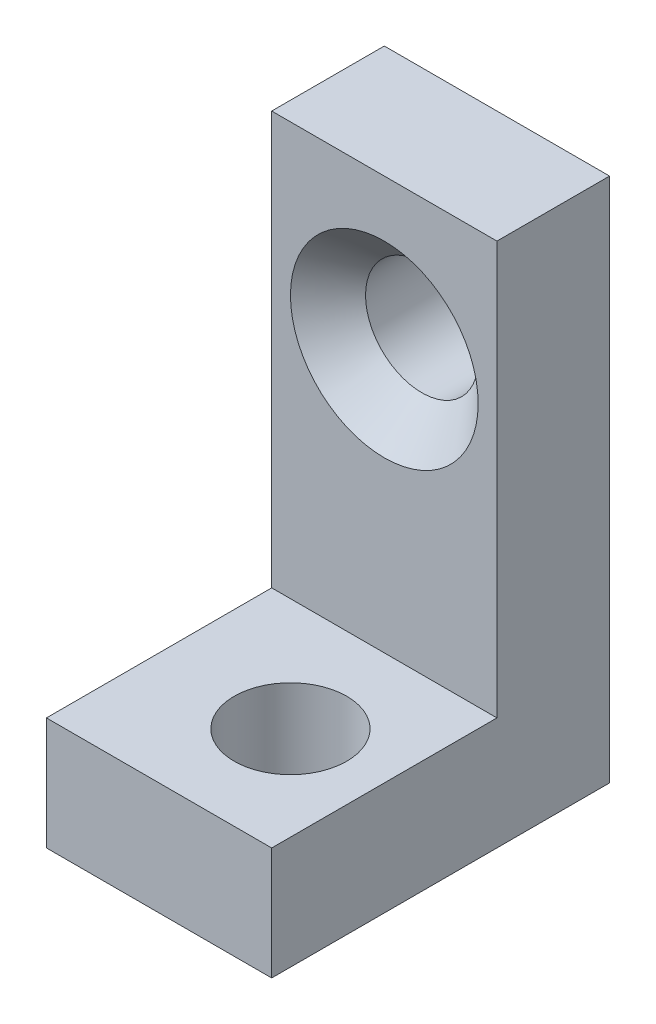
ISO-10303-21;
HEADER;
FILE_DESCRIPTION(('STEP AP214'),'2;1');
FILE_NAME('part.step','',(''),(''),'','','');
FILE_SCHEMA(('AUTOMOTIVE_DESIGN { 1 0 10303 214 1 1 1 1 }'));
ENDSEC;
DATA;
#1=APPLICATION_CONTEXT('core data for automotive mechanical design processes');
#2=APPLICATION_PROTOCOL_DEFINITION('international standard','automotive_design',2000,#1);
#3=PRODUCT_CONTEXT('',#1,'mechanical');
#4=PRODUCT('Part','Part','',(#3));
#5=PRODUCT_RELATED_PRODUCT_CATEGORY('part','',(#4));
#6=PRODUCT_DEFINITION_FORMATION('','',#4);
#7=PRODUCT_DEFINITION_CONTEXT('part definition',#1,'design');
#8=PRODUCT_DEFINITION('design','',#6,#7);
#9=PRODUCT_DEFINITION_SHAPE('','',#8);
#10=(LENGTH_UNIT() NAMED_UNIT(*) SI_UNIT(.MILLI.,.METRE.));
#11=(NAMED_UNIT(*) PLANE_ANGLE_UNIT() SI_UNIT($,.RADIAN.));
#12=(NAMED_UNIT(*) SI_UNIT($,.STERADIAN.) SOLID_ANGLE_UNIT());
#13=UNCERTAINTY_MEASURE_WITH_UNIT(LENGTH_MEASURE(1.E-05),#10,'distance_accuracy_value','');
#14=(GEOMETRIC_REPRESENTATION_CONTEXT(3) GLOBAL_UNCERTAINTY_ASSIGNED_CONTEXT((#13)) GLOBAL_UNIT_ASSIGNED_CONTEXT((#10,
#11,#12)) REPRESENTATION_CONTEXT('',''));
#15=CARTESIAN_POINT('',(0.,0.,0.));
#16=DIRECTION('',(0.,0.,1.));
#17=DIRECTION('',(1.,0.,0.));
#18=AXIS2_PLACEMENT_3D('',#15,#16,#17);
#19=CARTESIAN_POINT('',(0.,0.,3.));
#20=DIRECTION('',(0.,0.,-1.));
#21=DIRECTION('',(-1.,0.,0.));
#22=AXIS2_PLACEMENT_3D('',#19,#20,#21);
#23=PLANE('',#22);
#24=CARTESIAN_POINT('',(-1.02739726027398,2.98630136986301,3.));
#25=DIRECTION('',(0.,0.,-1.));
#26=DIRECTION('',(-1.,0.,0.));
#27=AXIS2_PLACEMENT_3D('',#24,#25,#26);
#28=CIRCLE('',#27,2.5);
#29=CARTESIAN_POINT('',(-3.52739726027398,2.98630136986301,3.));
#30=VERTEX_POINT('',#29);
#31=EDGE_CURVE('E11',#30,#30,#28,.T.);
#32=ORIENTED_EDGE('',*,*,#31,.T.);
#33=EDGE_LOOP('',(#32));
#34=FACE_BOUND('',#33,.T.);
#35=DIRECTION('',(-1.,0.,0.));
#36=VECTOR('',#35,1.);
#37=CARTESIAN_POINT('',(-4.02739726027398,-4.01369863013699,3.));
#38=LINE('',#37,#36);
#39=CARTESIAN_POINT('',(1.97260273972602,-4.01369863013699,3.));
#40=VERTEX_POINT('',#39);
#41=CARTESIAN_POINT('',(-4.02739726027398,-4.01369863013699,3.));
#42=VERTEX_POINT('',#41);
#43=EDGE_CURVE('E48',#40,#42,#38,.T.);
#44=ORIENTED_EDGE('',*,*,#43,.F.);
#45=DIRECTION('',(0.,1.,0.));
#46=VECTOR('',#45,1.);
#47=CARTESIAN_POINT('',(1.97260273972602,-7.01369863013699,3.));
#48=LINE('',#47,#46);
#49=CARTESIAN_POINT('',(1.97260273972602,6.98630136986301,3.));
#50=VERTEX_POINT('',#49);
#51=EDGE_CURVE('E86',#40,#50,#48,.T.);
#52=ORIENTED_EDGE('',*,*,#51,.T.);
#53=DIRECTION('',(-1.,0.,0.));
#54=VECTOR('',#53,1.);
#55=CARTESIAN_POINT('',(-4.02739726027398,6.98630136986301,3.));
#56=LINE('',#55,#54);
#57=CARTESIAN_POINT('',(-4.02739726027398,6.98630136986301,3.));
#58=VERTEX_POINT('',#57);
#59=EDGE_CURVE('E54',#50,#58,#56,.T.);
#60=ORIENTED_EDGE('',*,*,#59,.T.);
#61=DIRECTION('',(0.,-1.,0.));
#62=VECTOR('',#61,1.);
#63=CARTESIAN_POINT('',(-4.02739726027398,-7.01369863013699,3.));
#64=LINE('',#63,#62);
#65=EDGE_CURVE('E98',#58,#42,#64,.T.);
#66=ORIENTED_EDGE('',*,*,#65,.T.);
#67=EDGE_LOOP('',(#44,#52,#60,#66));
#68=FACE_BOUND('',#67,.T.);
#69=ADVANCED_FACE('F33',(#34,#68),#23,.F.);
#70=CARTESIAN_POINT('',(0.,0.,0.));
#71=DIRECTION('',(0.,0.,-1.));
#72=DIRECTION('',(-1.,0.,0.));
#73=AXIS2_PLACEMENT_3D('',#70,#71,#72);
#74=PLANE('',#73);
#75=DIRECTION('',(0.,1.,0.));
#76=VECTOR('',#75,1.);
#77=CARTESIAN_POINT('',(1.97260273972602,-7.01369863013699,0.));
#78=LINE('',#77,#76);
#79=CARTESIAN_POINT('',(1.97260273972602,-7.01369863013699,0.));
#80=VERTEX_POINT('',#79);
#81=CARTESIAN_POINT('',(1.97260273972602,6.98630136986301,0.));
#82=VERTEX_POINT('',#81);
#83=EDGE_CURVE('E94',#80,#82,#78,.T.);
#84=ORIENTED_EDGE('',*,*,#83,.F.);
#85=DIRECTION('',(1.,0.,0.));
#86=VECTOR('',#85,1.);
#87=CARTESIAN_POINT('',(-4.02739726027398,-7.01369863013699,0.));
#88=LINE('',#87,#86);
#89=CARTESIAN_POINT('',(-4.02739726027398,-7.01369863013699,0.));
#90=VERTEX_POINT('',#89);
#91=EDGE_CURVE('E74',#90,#80,#88,.T.);
#92=ORIENTED_EDGE('',*,*,#91,.F.);
#93=DIRECTION('',(0.,-1.,0.));
#94=VECTOR('',#93,1.);
#95=CARTESIAN_POINT('',(-4.02739726027398,-7.01369863013699,0.));
#96=LINE('',#95,#94);
#97=CARTESIAN_POINT('',(-4.02739726027398,6.98630136986301,0.));
#98=VERTEX_POINT('',#97);
#99=EDGE_CURVE('E87',#98,#90,#96,.T.);
#100=ORIENTED_EDGE('',*,*,#99,.F.);
#101=DIRECTION('',(-1.,0.,0.));
#102=VECTOR('',#101,1.);
#103=CARTESIAN_POINT('',(-4.02739726027398,6.98630136986301,0.));
#104=LINE('',#103,#102);
#105=EDGE_CURVE('E102',#82,#98,#104,.T.);
#106=ORIENTED_EDGE('',*,*,#105,.F.);
#107=EDGE_LOOP('',(#84,#92,#100,#106));
#108=FACE_BOUND('',#107,.T.);
#109=CARTESIAN_POINT('',(-1.02739726027398,2.98630136986301,0.));
#110=DIRECTION('',(0.,0.,1.));
#111=DIRECTION('',(1.,0.,0.));
#112=AXIS2_PLACEMENT_3D('',#109,#110,#111);
#113=CIRCLE('',#112,1.5);
#114=CARTESIAN_POINT('',(0.472602739726022,2.98630136986301,0.));
#115=VERTEX_POINT('',#114);
#116=EDGE_CURVE('E104',#115,#115,#113,.T.);
#117=ORIENTED_EDGE('',*,*,#116,.T.);
#118=EDGE_LOOP('',(#117));
#119=FACE_BOUND('',#118,.T.);
#120=ADVANCED_FACE('F100',(#108,#119),#74,.T.);
#121=CARTESIAN_POINT('',(1.97260273972602,-7.01369863013699,3.));
#122=DIRECTION('',(-1.,0.,0.));
#123=DIRECTION('',(0.,-1.,0.));
#124=AXIS2_PLACEMENT_3D('',#121,#122,#123);
#125=PLANE('',#124);
#126=ORIENTED_EDGE('',*,*,#83,.T.);
#127=DIRECTION('',(0.,0.,-1.));
#128=VECTOR('',#127,1.);
#129=CARTESIAN_POINT('',(1.97260273972602,6.98630136986301,3.));
#130=LINE('',#129,#128);
#131=EDGE_CURVE('E118',#50,#82,#130,.T.);
#132=ORIENTED_EDGE('',*,*,#131,.F.);
#133=ORIENTED_EDGE('',*,*,#51,.F.);
#134=DIRECTION('',(0.,0.,-1.));
#135=VECTOR('',#134,1.);
#136=CARTESIAN_POINT('',(1.97260273972602,-4.01369863013699,9.));
#137=LINE('',#136,#135);
#138=CARTESIAN_POINT('',(1.97260273972602,-4.01369863013699,9.));
#139=VERTEX_POINT('',#138);
#140=EDGE_CURVE('E108',#139,#40,#137,.T.);
#141=ORIENTED_EDGE('',*,*,#140,.F.);
#142=DIRECTION('',(0.,1.,0.));
#143=VECTOR('',#142,1.);
#144=CARTESIAN_POINT('',(1.97260273972602,-7.01369863013699,9.));
#145=LINE('',#144,#143);
#146=CARTESIAN_POINT('',(1.97260273972602,-7.01369863013699,9.));
#147=VERTEX_POINT('',#146);
#148=EDGE_CURVE('E97',#147,#139,#145,.T.);
#149=ORIENTED_EDGE('',*,*,#148,.F.);
#150=DIRECTION('',(0.,0.,-1.));
#151=VECTOR('',#150,1.);
#152=CARTESIAN_POINT('',(1.97260273972602,-7.01369863013699,3.));
#153=LINE('',#152,#151);
#154=EDGE_CURVE('E79',#147,#80,#153,.T.);
#155=ORIENTED_EDGE('',*,*,#154,.T.);
#156=EDGE_LOOP('',(#126,#132,#133,#141,#149,#155));
#157=FACE_BOUND('',#156,.T.);
#158=ADVANCED_FACE('F92',(#157),#125,.F.);
#159=CARTESIAN_POINT('',(-4.02739726027398,6.98630136986301,3.));
#160=DIRECTION('',(0.,-1.,0.));
#161=DIRECTION('',(0.,0.,-1.));
#162=AXIS2_PLACEMENT_3D('',#159,#160,#161);
#163=PLANE('',#162);
#164=ORIENTED_EDGE('',*,*,#105,.T.);
#165=DIRECTION('',(0.,0.,-1.));
#166=VECTOR('',#165,1.);
#167=CARTESIAN_POINT('',(-4.02739726027398,6.98630136986301,3.));
#168=LINE('',#167,#166);
#169=EDGE_CURVE('E115',#58,#98,#168,.T.);
#170=ORIENTED_EDGE('',*,*,#169,.F.);
#171=ORIENTED_EDGE('',*,*,#59,.F.);
#172=ORIENTED_EDGE('',*,*,#131,.T.);
#173=EDGE_LOOP('',(#164,#170,#171,#172));
#174=FACE_BOUND('',#173,.T.);
#175=ADVANCED_FACE('F155',(#174),#163,.F.);
#176=CARTESIAN_POINT('',(-4.02739726027398,-7.01369863013699,3.));
#177=DIRECTION('',(1.,0.,0.));
#178=DIRECTION('',(0.,0.,-1.));
#179=AXIS2_PLACEMENT_3D('',#176,#177,#178);
#180=PLANE('',#179);
#181=ORIENTED_EDGE('',*,*,#99,.T.);
#182=DIRECTION('',(0.,0.,-1.));
#183=VECTOR('',#182,1.);
#184=CARTESIAN_POINT('',(-4.02739726027398,-7.01369863013699,3.));
#185=LINE('',#184,#183);
#186=CARTESIAN_POINT('',(-4.02739726027398,-7.01369863013699,9.));
#187=VERTEX_POINT('',#186);
#188=EDGE_CURVE('E82',#187,#90,#185,.T.);
#189=ORIENTED_EDGE('',*,*,#188,.F.);
#190=DIRECTION('',(0.,-1.,0.));
#191=VECTOR('',#190,1.);
#192=CARTESIAN_POINT('',(-4.02739726027398,-7.01369863013699,9.));
#193=LINE('',#192,#191);
#194=CARTESIAN_POINT('',(-4.02739726027398,-4.01369863013699,9.));
#195=VERTEX_POINT('',#194);
#196=EDGE_CURVE('E242',#195,#187,#193,.T.);
#197=ORIENTED_EDGE('',*,*,#196,.F.);
#198=DIRECTION('',(0.,0.,-1.));
#199=VECTOR('',#198,1.);
#200=CARTESIAN_POINT('',(-4.02739726027398,-4.01369863013699,9.));
#201=LINE('',#200,#199);
#202=EDGE_CURVE('E256',#195,#42,#201,.T.);
#203=ORIENTED_EDGE('',*,*,#202,.T.);
#204=ORIENTED_EDGE('',*,*,#65,.F.);
#205=ORIENTED_EDGE('',*,*,#169,.T.);
#206=EDGE_LOOP('',(#181,#189,#197,#203,#204,#205));
#207=FACE_BOUND('',#206,.T.);
#208=ADVANCED_FACE('F151',(#207),#180,.F.);
#209=CARTESIAN_POINT('',(-4.02739726027398,-7.01369863013699,3.));
#210=DIRECTION('',(0.,1.,0.));
#211=DIRECTION('',(0.,0.,1.));
#212=AXIS2_PLACEMENT_3D('',#209,#210,#211);
#213=PLANE('',#212);
#214=CARTESIAN_POINT('',(-0.527397260273978,-7.01369863013699,6.));
#215=DIRECTION('',(0.,-1.,0.));
#216=DIRECTION('',(0.,0.,-1.));
#217=AXIS2_PLACEMENT_3D('',#214,#215,#216);
#218=CIRCLE('',#217,1.5);
#219=CARTESIAN_POINT('',(-0.527397260273978,-7.01369863013699,4.5));
#220=VERTEX_POINT('',#219);
#221=EDGE_CURVE('E122',#220,#220,#218,.T.);
#222=ORIENTED_EDGE('',*,*,#221,.F.);
#223=EDGE_LOOP('',(#222));
#224=FACE_BOUND('',#223,.T.);
#225=ORIENTED_EDGE('',*,*,#91,.T.);
#226=ORIENTED_EDGE('',*,*,#154,.F.);
#227=DIRECTION('',(1.,0.,0.));
#228=VECTOR('',#227,1.);
#229=CARTESIAN_POINT('',(-4.02739726027398,-7.01369863013699,9.));
#230=LINE('',#229,#228);
#231=EDGE_CURVE('E243',#187,#147,#230,.T.);
#232=ORIENTED_EDGE('',*,*,#231,.F.);
#233=ORIENTED_EDGE('',*,*,#188,.T.);
#234=EDGE_LOOP('',(#225,#226,#232,#233));
#235=FACE_BOUND('',#234,.T.);
#236=ADVANCED_FACE('F76',(#224,#235),#213,.F.);
#237=CARTESIAN_POINT('',(-1.02739726027398,2.98630136986301,3.));
#238=DIRECTION('',(0.,0.,-1.));
#239=DIRECTION('',(-1.,0.,0.));
#240=AXIS2_PLACEMENT_3D('',#237,#238,#239);
#241=CYLINDRICAL_SURFACE('',#240,1.5);
#242=CARTESIAN_POINT('',(-1.02739726027398,2.98630136986301,2.));
#243=DIRECTION('',(0.,0.,-1.));
#244=DIRECTION('',(-1.,0.,0.));
#245=AXIS2_PLACEMENT_3D('',#242,#243,#244);
#246=CIRCLE('',#245,1.5);
#247=CARTESIAN_POINT('',(-2.52739726027398,2.98630136986301,2.));
#248=VERTEX_POINT('',#247);
#249=EDGE_CURVE('E41',#248,#248,#246,.F.);
#250=ORIENTED_EDGE('',*,*,#249,.T.);
#251=EDGE_LOOP('',(#250));
#252=FACE_BOUND('',#251,.T.);
#253=ORIENTED_EDGE('',*,*,#116,.F.);
#254=EDGE_LOOP('',(#253));
#255=FACE_BOUND('',#254,.T.);
#256=ADVANCED_FACE('F126',(#252,#255),#241,.F.);
#257=CARTESIAN_POINT('',(-4.02739726027398,-4.01369863013699,9.));
#258=DIRECTION('',(0.,-1.,0.));
#259=DIRECTION('',(0.,0.,-1.));
#260=AXIS2_PLACEMENT_3D('',#257,#258,#259);
#261=PLANE('',#260);
#262=CARTESIAN_POINT('',(-0.527397260273978,-4.01369863013699,6.));
#263=DIRECTION('',(0.,-1.,0.));
#264=DIRECTION('',(0.,0.,-1.));
#265=AXIS2_PLACEMENT_3D('',#262,#263,#264);
#266=CIRCLE('',#265,1.5);
#267=CARTESIAN_POINT('',(-0.527397260273978,-4.01369863013699,4.5));
#268=VERTEX_POINT('',#267);
#269=EDGE_CURVE('E120',#268,#268,#266,.T.);
#270=ORIENTED_EDGE('',*,*,#269,.T.);
#271=EDGE_LOOP('',(#270));
#272=FACE_BOUND('',#271,.T.);
#273=ORIENTED_EDGE('',*,*,#43,.T.);
#274=ORIENTED_EDGE('',*,*,#202,.F.);
#275=DIRECTION('',(-1.,0.,0.));
#276=VECTOR('',#275,1.);
#277=CARTESIAN_POINT('',(-4.02739726027398,-4.01369863013699,9.));
#278=LINE('',#277,#276);
#279=EDGE_CURVE('E245',#139,#195,#278,.T.);
#280=ORIENTED_EDGE('',*,*,#279,.F.);
#281=ORIENTED_EDGE('',*,*,#140,.T.);
#282=EDGE_LOOP('',(#273,#274,#280,#281));
#283=FACE_BOUND('',#282,.T.);
#284=ADVANCED_FACE('F184',(#272,#283),#261,.F.);
#285=CARTESIAN_POINT('',(0.,0.,9.));
#286=DIRECTION('',(0.,0.,-1.));
#287=DIRECTION('',(-1.,0.,0.));
#288=AXIS2_PLACEMENT_3D('',#285,#286,#287);
#289=PLANE('',#288);
#290=ORIENTED_EDGE('',*,*,#196,.T.);
#291=ORIENTED_EDGE('',*,*,#231,.T.);
#292=ORIENTED_EDGE('',*,*,#148,.T.);
#293=ORIENTED_EDGE('',*,*,#279,.T.);
#294=EDGE_LOOP('',(#290,#291,#292,#293));
#295=FACE_BOUND('',#294,.T.);
#296=ADVANCED_FACE('F135',(#295),#289,.F.);
#297=CARTESIAN_POINT('',(-0.527397260273978,2.98630136986301,6.));
#298=DIRECTION('',(0.,-1.,0.));
#299=DIRECTION('',(0.,0.,-1.));
#300=AXIS2_PLACEMENT_3D('',#297,#298,#299);
#301=CYLINDRICAL_SURFACE('',#300,1.5);
#302=ORIENTED_EDGE('',*,*,#221,.T.);
#303=EDGE_LOOP('',(#302));
#304=FACE_BOUND('',#303,.T.);
#305=ORIENTED_EDGE('',*,*,#269,.F.);
#306=EDGE_LOOP('',(#305));
#307=FACE_BOUND('',#306,.T.);
#308=ADVANCED_FACE('F130',(#304,#307),#301,.F.);
#309=CARTESIAN_POINT('',(-1.02739726027398,2.98630136986301,2.));
#310=DIRECTION('',(0.,0.,1.));
#311=DIRECTION('',(1.,0.,0.));
#312=AXIS2_PLACEMENT_3D('',#309,#310,#311);
#313=CONICAL_SURFACE('',#312,1.5,0.78539816339745);
#314=ORIENTED_EDGE('',*,*,#31,.F.);
#315=EDGE_LOOP('',(#314));
#316=FACE_BOUND('',#315,.T.);
#317=ORIENTED_EDGE('',*,*,#249,.F.);
#318=EDGE_LOOP('',(#317));
#319=FACE_BOUND('',#318,.T.);
#320=ADVANCED_FACE('F35',(#316,#319),#313,.F.);
#321=CLOSED_SHELL('',(#69,#120,#158,#175,#208,#236,#256,#284,#296,#308,#320));
#322=MANIFOLD_SOLID_BREP('B2',#321);
#323=ADVANCED_BREP_SHAPE_REPRESENTATION('',(#18,#322),#14);
#324=SHAPE_DEFINITION_REPRESENTATION(#9,#323);
ENDSEC;
END-ISO-10303-21;
